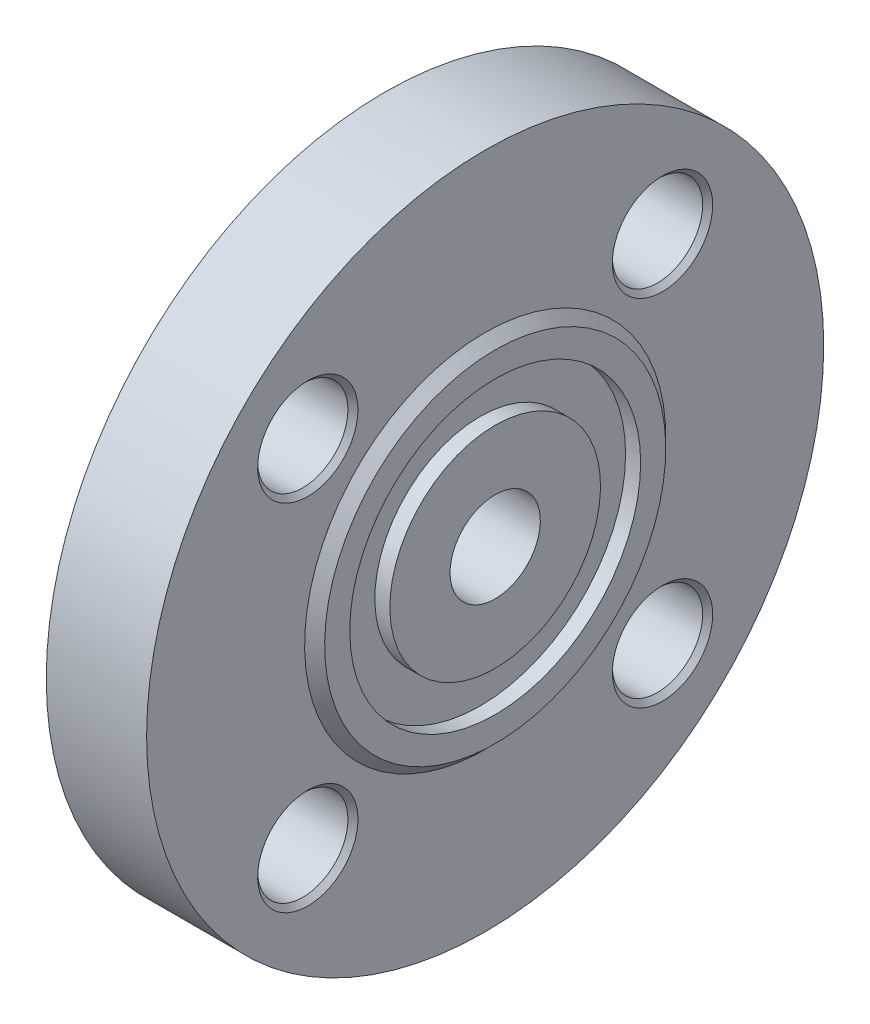
ISO-10303-21;
HEADER;
FILE_DESCRIPTION(('STEP AP214'),'2;1');
FILE_NAME('part.step','',(''),(''),'','','');
FILE_SCHEMA(('AUTOMOTIVE_DESIGN { 1 0 10303 214 1 1 1 1 }'));
ENDSEC;
DATA;
#1=APPLICATION_CONTEXT('core data for automotive mechanical design processes');
#2=APPLICATION_PROTOCOL_DEFINITION('international standard','automotive_design',2000,#1);
#3=PRODUCT_CONTEXT('',#1,'mechanical');
#4=PRODUCT('Part','Part','',(#3));
#5=PRODUCT_RELATED_PRODUCT_CATEGORY('part','',(#4));
#6=PRODUCT_DEFINITION_FORMATION('','',#4);
#7=PRODUCT_DEFINITION_CONTEXT('part definition',#1,'design');
#8=PRODUCT_DEFINITION('design','',#6,#7);
#9=PRODUCT_DEFINITION_SHAPE('','',#8);
#10=(LENGTH_UNIT() NAMED_UNIT(*) SI_UNIT(.MILLI.,.METRE.));
#11=(NAMED_UNIT(*) PLANE_ANGLE_UNIT() SI_UNIT($,.RADIAN.));
#12=(NAMED_UNIT(*) SI_UNIT($,.STERADIAN.) SOLID_ANGLE_UNIT());
#13=UNCERTAINTY_MEASURE_WITH_UNIT(LENGTH_MEASURE(1.E-05),#10,'distance_accuracy_value','');
#14=(GEOMETRIC_REPRESENTATION_CONTEXT(3) GLOBAL_UNCERTAINTY_ASSIGNED_CONTEXT((#13)) GLOBAL_UNIT_ASSIGNED_CONTEXT((#10,
#11,#12)) REPRESENTATION_CONTEXT('',''));
#15=CARTESIAN_POINT('',(0.,0.,0.));
#16=DIRECTION('',(0.,0.,1.));
#17=DIRECTION('',(1.,0.,0.));
#18=AXIS2_PLACEMENT_3D('',#15,#16,#17);
#19=CARTESIAN_POINT('',(0.,21.,0.));
#20=DIRECTION('',(1.,0.,0.));
#21=DIRECTION('',(0.,1.,0.));
#22=AXIS2_PLACEMENT_3D('',#19,#20,#21);
#23=PLANE('',#22);
#24=CARTESIAN_POINT('',(0.,0.,0.));
#25=DIRECTION('',(1.,0.,0.));
#26=DIRECTION('',(0.,1.,0.));
#27=AXIS2_PLACEMENT_3D('',#24,#25,#26);
#28=CIRCLE('',#27,21.);
#29=CARTESIAN_POINT('',(0.,21.,0.));
#30=VERTEX_POINT('',#29);
#31=EDGE_CURVE('E96',#30,#30,#28,.T.);
#32=ORIENTED_EDGE('',*,*,#31,.T.);
#33=EDGE_LOOP('',(#32));
#34=FACE_BOUND('',#33,.T.);
#35=CARTESIAN_POINT('',(0.,0.,0.));
#36=DIRECTION('',(1.,0.,0.));
#37=DIRECTION('',(0.,1.,0.));
#38=AXIS2_PLACEMENT_3D('',#35,#36,#37);
#39=CIRCLE('',#38,9.);
#40=CARTESIAN_POINT('',(0.,9.,0.));
#41=VERTEX_POINT('',#40);
#42=EDGE_CURVE('E135',#41,#41,#39,.T.);
#43=ORIENTED_EDGE('',*,*,#42,.F.);
#44=EDGE_LOOP('',(#43));
#45=FACE_BOUND('',#44,.T.);
#46=ADVANCED_FACE('F37',(#34,#45),#23,.T.);
#47=CARTESIAN_POINT('',(0.,0.,0.));
#48=DIRECTION('',(1.,0.,0.));
#49=DIRECTION('',(0.,1.,0.));
#50=AXIS2_PLACEMENT_3D('',#47,#48,#49);
#51=CYLINDRICAL_SURFACE('',#50,21.);
#52=CARTESIAN_POINT('',(-3.,0.,0.));
#53=DIRECTION('',(1.,0.,0.));
#54=DIRECTION('',(0.,1.,0.));
#55=AXIS2_PLACEMENT_3D('',#52,#53,#54);
#56=CIRCLE('',#55,21.);
#57=CARTESIAN_POINT('',(-3.,21.,0.));
#58=VERTEX_POINT('',#57);
#59=EDGE_CURVE('E99',#58,#58,#56,.T.);
#60=ORIENTED_EDGE('',*,*,#59,.T.);
#61=EDGE_LOOP('',(#60));
#62=FACE_BOUND('',#61,.T.);
#63=ORIENTED_EDGE('',*,*,#31,.F.);
#64=EDGE_LOOP('',(#63));
#65=FACE_BOUND('',#64,.T.);
#66=ADVANCED_FACE('F163',(#62,#65),#51,.T.);
#67=CARTESIAN_POINT('',(-3.,29.,0.));
#68=DIRECTION('',(1.,0.,0.));
#69=DIRECTION('',(0.,1.,0.));
#70=AXIS2_PLACEMENT_3D('',#67,#68,#69);
#71=PLANE('',#70);
#72=CARTESIAN_POINT('',(-3.,0.,0.));
#73=DIRECTION('',(1.,0.,0.));
#74=DIRECTION('',(0.,1.,0.));
#75=AXIS2_PLACEMENT_3D('',#72,#73,#74);
#76=CIRCLE('',#75,29.);
#77=CARTESIAN_POINT('',(-3.,29.,0.));
#78=VERTEX_POINT('',#77);
#79=EDGE_CURVE('E102',#78,#78,#76,.T.);
#80=ORIENTED_EDGE('',*,*,#79,.T.);
#81=EDGE_LOOP('',(#80));
#82=FACE_BOUND('',#81,.T.);
#83=ORIENTED_EDGE('',*,*,#59,.F.);
#84=EDGE_LOOP('',(#83));
#85=FACE_BOUND('',#84,.T.);
#86=ADVANCED_FACE('F169',(#82,#85),#71,.T.);
#87=CARTESIAN_POINT('',(0.,0.,0.));
#88=DIRECTION('',(1.,0.,0.));
#89=DIRECTION('',(0.,1.,0.));
#90=AXIS2_PLACEMENT_3D('',#87,#88,#89);
#91=CYLINDRICAL_SURFACE('',#90,29.);
#92=CARTESIAN_POINT('',(0.,0.,0.));
#93=DIRECTION('',(1.,0.,0.));
#94=DIRECTION('',(0.,1.,0.));
#95=AXIS2_PLACEMENT_3D('',#92,#93,#94);
#96=CIRCLE('',#95,29.);
#97=CARTESIAN_POINT('',(0.,29.,0.));
#98=VERTEX_POINT('',#97);
#99=EDGE_CURVE('E105',#98,#98,#96,.T.);
#100=ORIENTED_EDGE('',*,*,#99,.T.);
#101=EDGE_LOOP('',(#100));
#102=FACE_BOUND('',#101,.T.);
#103=ORIENTED_EDGE('',*,*,#79,.F.);
#104=EDGE_LOOP('',(#103));
#105=FACE_BOUND('',#104,.T.);
#106=ADVANCED_FACE('F424',(#102,#105),#91,.F.);
#107=CARTESIAN_POINT('',(0.,34.,0.));
#108=DIRECTION('',(1.,0.,0.));
#109=DIRECTION('',(0.,1.,0.));
#110=AXIS2_PLACEMENT_3D('',#107,#108,#109);
#111=PLANE('',#110);
#112=CARTESIAN_POINT('',(0.,0.,0.));
#113=DIRECTION('',(1.,0.,0.));
#114=DIRECTION('',(0.,1.,0.));
#115=AXIS2_PLACEMENT_3D('',#112,#113,#114);
#116=CIRCLE('',#115,34.);
#117=CARTESIAN_POINT('',(0.,34.,0.));
#118=VERTEX_POINT('',#117);
#119=EDGE_CURVE('E108',#118,#118,#116,.T.);
#120=ORIENTED_EDGE('',*,*,#119,.T.);
#121=EDGE_LOOP('',(#120));
#122=FACE_BOUND('',#121,.T.);
#123=ORIENTED_EDGE('',*,*,#99,.F.);
#124=EDGE_LOOP('',(#123));
#125=FACE_BOUND('',#124,.T.);
#126=ADVANCED_FACE('F415',(#122,#125),#111,.T.);
#127=CARTESIAN_POINT('',(0.,0.,0.));
#128=DIRECTION('',(-1.,0.,0.));
#129=DIRECTION('',(0.,-1.,0.));
#130=AXIS2_PLACEMENT_3D('',#127,#128,#129);
#131=CONICAL_SURFACE('',#130,34.,0.785398163397454);
#132=CARTESIAN_POINT('',(-2.,0.,0.));
#133=DIRECTION('',(1.,0.,0.));
#134=DIRECTION('',(0.,1.,0.));
#135=AXIS2_PLACEMENT_3D('',#132,#133,#134);
#136=CIRCLE('',#135,36.);
#137=CARTESIAN_POINT('',(-2.,36.,0.));
#138=VERTEX_POINT('',#137);
#139=EDGE_CURVE('E111',#138,#138,#136,.T.);
#140=ORIENTED_EDGE('',*,*,#139,.T.);
#141=EDGE_LOOP('',(#140));
#142=FACE_BOUND('',#141,.T.);
#143=ORIENTED_EDGE('',*,*,#119,.F.);
#144=EDGE_LOOP('',(#143));
#145=FACE_BOUND('',#144,.T.);
#146=ADVANCED_FACE('F408',(#142,#145),#131,.T.);
#147=CARTESIAN_POINT('',(-2.,67.5,0.));
#148=DIRECTION('',(1.,0.,0.));
#149=DIRECTION('',(0.,1.,0.));
#150=AXIS2_PLACEMENT_3D('',#147,#148,#149);
#151=PLANE('',#150);
#152=CARTESIAN_POINT('',(-1.99999999999999,-35.3553390593268,-35.3553390593279));
#153=DIRECTION('',(1.,0.,0.));
#154=DIRECTION('',(0.,1.,0.));
#155=AXIS2_PLACEMENT_3D('',#152,#153,#154);
#156=CIRCLE('',#155,10.);
#157=CARTESIAN_POINT('',(-1.99999999999999,-25.3553390593268,-35.3553390593279));
#158=VERTEX_POINT('',#157);
#159=EDGE_CURVE('E44',#158,#158,#156,.F.);
#160=ORIENTED_EDGE('',*,*,#159,.T.);
#161=EDGE_LOOP('',(#160));
#162=FACE_BOUND('',#161,.T.);
#163=CARTESIAN_POINT('',(-1.99999999999999,-35.3553390593276,35.3553390593272));
#164=DIRECTION('',(1.,0.,0.));
#165=DIRECTION('',(0.,1.,0.));
#166=AXIS2_PLACEMENT_3D('',#163,#164,#165);
#167=CIRCLE('',#166,10.);
#168=CARTESIAN_POINT('',(-1.99999999999999,-25.3553390593276,35.3553390593272));
#169=VERTEX_POINT('',#168);
#170=EDGE_CURVE('E60',#169,#169,#167,.F.);
#171=ORIENTED_EDGE('',*,*,#170,.T.);
#172=EDGE_LOOP('',(#171));
#173=FACE_BOUND('',#172,.T.);
#174=CARTESIAN_POINT('',(-2.,35.3553390593271,35.3553390593277));
#175=DIRECTION('',(1.,0.,0.));
#176=DIRECTION('',(0.,1.,0.));
#177=AXIS2_PLACEMENT_3D('',#174,#175,#176);
#178=CIRCLE('',#177,10.);
#179=CARTESIAN_POINT('',(-2.,45.3553390593271,35.3553390593277));
#180=VERTEX_POINT('',#179);
#181=EDGE_CURVE('E72',#180,#180,#178,.F.);
#182=ORIENTED_EDGE('',*,*,#181,.T.);
#183=EDGE_LOOP('',(#182));
#184=FACE_BOUND('',#183,.T.);
#185=CARTESIAN_POINT('',(-2.,35.3553390593276,-35.3553390593272));
#186=DIRECTION('',(1.,0.,0.));
#187=DIRECTION('',(0.,1.,0.));
#188=AXIS2_PLACEMENT_3D('',#185,#186,#187);
#189=CIRCLE('',#188,9.99999999999999);
#190=CARTESIAN_POINT('',(-2.,45.3553390593276,-35.3553390593272));
#191=VERTEX_POINT('',#190);
#192=EDGE_CURVE('E84',#191,#191,#189,.F.);
#193=ORIENTED_EDGE('',*,*,#192,.T.);
#194=EDGE_LOOP('',(#193));
#195=FACE_BOUND('',#194,.T.);
#196=CARTESIAN_POINT('',(-2.,0.,0.));
#197=DIRECTION('',(1.,0.,0.));
#198=DIRECTION('',(0.,1.,0.));
#199=AXIS2_PLACEMENT_3D('',#196,#197,#198);
#200=CIRCLE('',#199,67.5);
#201=CARTESIAN_POINT('',(-2.00000000000001,67.5,0.));
#202=VERTEX_POINT('',#201);
#203=EDGE_CURVE('E114',#202,#202,#200,.T.);
#204=ORIENTED_EDGE('',*,*,#203,.T.);
#205=EDGE_LOOP('',(#204));
#206=FACE_BOUND('',#205,.T.);
#207=ORIENTED_EDGE('',*,*,#139,.F.);
#208=EDGE_LOOP('',(#207));
#209=FACE_BOUND('',#208,.T.);
#210=ADVANCED_FACE('F399',(#162,#173,#184,#195,#206,#209),#151,.T.);
#211=CARTESIAN_POINT('',(0.,0.,0.));
#212=DIRECTION('',(1.,0.,0.));
#213=DIRECTION('',(0.,1.,0.));
#214=AXIS2_PLACEMENT_3D('',#211,#212,#213);
#215=CYLINDRICAL_SURFACE('',#214,67.5);
#216=CARTESIAN_POINT('',(-22.,0.,0.));
#217=DIRECTION('',(1.,0.,0.));
#218=DIRECTION('',(0.,1.,0.));
#219=AXIS2_PLACEMENT_3D('',#216,#217,#218);
#220=CIRCLE('',#219,67.5);
#221=CARTESIAN_POINT('',(-22.,67.5,0.));
#222=VERTEX_POINT('',#221);
#223=EDGE_CURVE('E117',#222,#222,#220,.T.);
#224=ORIENTED_EDGE('',*,*,#223,.T.);
#225=EDGE_LOOP('',(#224));
#226=FACE_BOUND('',#225,.T.);
#227=ORIENTED_EDGE('',*,*,#203,.F.);
#228=EDGE_LOOP('',(#227));
#229=FACE_BOUND('',#228,.T.);
#230=ADVANCED_FACE('F391',(#226,#229),#215,.T.);
#231=CARTESIAN_POINT('',(-22.,29.3725425842122,0.));
#232=DIRECTION('',(-1.,0.,0.));
#233=DIRECTION('',(0.,-1.,0.));
#234=AXIS2_PLACEMENT_3D('',#231,#232,#233);
#235=PLANE('',#234);
#236=CARTESIAN_POINT('',(-22.,-35.3553390593268,-35.3553390593279));
#237=DIRECTION('',(-1.,0.,0.));
#238=DIRECTION('',(0.,-1.,0.));
#239=AXIS2_PLACEMENT_3D('',#236,#237,#238);
#240=CIRCLE('',#239,10.);
#241=CARTESIAN_POINT('',(-22.,-45.3553390593268,-35.3553390593279));
#242=VERTEX_POINT('',#241);
#243=EDGE_CURVE('E10',#242,#242,#240,.F.);
#244=ORIENTED_EDGE('',*,*,#243,.T.);
#245=EDGE_LOOP('',(#244));
#246=FACE_BOUND('',#245,.T.);
#247=CARTESIAN_POINT('',(-22.,-35.3553390593276,35.3553390593272));
#248=DIRECTION('',(-1.,0.,0.));
#249=DIRECTION('',(0.,-1.,0.));
#250=AXIS2_PLACEMENT_3D('',#247,#248,#249);
#251=CIRCLE('',#250,9.99999999999999);
#252=CARTESIAN_POINT('',(-22.,-45.3553390593276,35.3553390593272));
#253=VERTEX_POINT('',#252);
#254=EDGE_CURVE('E57',#253,#253,#251,.F.);
#255=ORIENTED_EDGE('',*,*,#254,.T.);
#256=EDGE_LOOP('',(#255));
#257=FACE_BOUND('',#256,.T.);
#258=CARTESIAN_POINT('',(-22.,35.3553390593271,35.3553390593277));
#259=DIRECTION('',(-1.,0.,0.));
#260=DIRECTION('',(0.,-1.,0.));
#261=AXIS2_PLACEMENT_3D('',#258,#259,#260);
#262=CIRCLE('',#261,10.);
#263=CARTESIAN_POINT('',(-22.,25.355339059327,35.3553390593277));
#264=VERTEX_POINT('',#263);
#265=EDGE_CURVE('E69',#264,#264,#262,.F.);
#266=ORIENTED_EDGE('',*,*,#265,.T.);
#267=EDGE_LOOP('',(#266));
#268=FACE_BOUND('',#267,.T.);
#269=CARTESIAN_POINT('',(-22.,35.3553390593276,-35.3553390593272));
#270=DIRECTION('',(-1.,0.,0.));
#271=DIRECTION('',(0.,-1.,0.));
#272=AXIS2_PLACEMENT_3D('',#269,#270,#271);
#273=CIRCLE('',#272,9.99999999999998);
#274=CARTESIAN_POINT('',(-22.,25.3553390593276,-35.3553390593272));
#275=VERTEX_POINT('',#274);
#276=EDGE_CURVE('E81',#275,#275,#273,.F.);
#277=ORIENTED_EDGE('',*,*,#276,.T.);
#278=EDGE_LOOP('',(#277));
#279=FACE_BOUND('',#278,.T.);
#280=CARTESIAN_POINT('',(-22.,0.,0.));
#281=DIRECTION('',(1.,0.,0.));
#282=DIRECTION('',(0.,1.,0.));
#283=AXIS2_PLACEMENT_3D('',#280,#281,#282);
#284=CIRCLE('',#283,29.3725425842122);
#285=CARTESIAN_POINT('',(-22.,29.3725425842122,0.));
#286=VERTEX_POINT('',#285);
#287=EDGE_CURVE('E120',#286,#286,#284,.T.);
#288=ORIENTED_EDGE('',*,*,#287,.T.);
#289=EDGE_LOOP('',(#288));
#290=FACE_BOUND('',#289,.T.);
#291=ORIENTED_EDGE('',*,*,#223,.F.);
#292=EDGE_LOOP('',(#291));
#293=FACE_BOUND('',#292,.T.);
#294=ADVANCED_FACE('F382',(#246,#257,#268,#279,#290,#293),#235,.T.);
#295=CARTESIAN_POINT('',(-27.,0.,0.));
#296=DIRECTION('',(1.,0.,0.));
#297=DIRECTION('',(0.,1.,0.));
#298=AXIS2_PLACEMENT_3D('',#295,#296,#297);
#299=TOROIDAL_SURFACE('',#298,29.3725425842122,5.);
#300=CARTESIAN_POINT('',(-25.1269670329205,0.,0.));
#301=DIRECTION('',(1.,0.,0.));
#302=DIRECTION('',(0.,1.,0.));
#303=AXIS2_PLACEMENT_3D('',#300,#301,#302);
#304=CIRCLE('',#303,24.7366233113782);
#305=CARTESIAN_POINT('',(-25.1269670329205,24.7366233113782,0.));
#306=VERTEX_POINT('',#305);
#307=EDGE_CURVE('E123',#306,#306,#304,.T.);
#308=ORIENTED_EDGE('',*,*,#307,.T.);
#309=EDGE_LOOP('',(#308));
#310=FACE_BOUND('',#309,.T.);
#311=ORIENTED_EDGE('',*,*,#287,.F.);
#312=EDGE_LOOP('',(#311));
#313=FACE_BOUND('',#312,.T.);
#314=ADVANCED_FACE('F374',(#310,#313),#299,.F.);
#315=CARTESIAN_POINT('',(-25.1269670329205,0.,0.));
#316=DIRECTION('',(1.,0.,0.));
#317=DIRECTION('',(0.,1.,0.));
#318=AXIS2_PLACEMENT_3D('',#315,#316,#317);
#319=CONICAL_SURFACE('',#318,24.7366233113782,0.383972435438746);
#320=CARTESIAN_POINT('',(-45.8497371127724,0.,0.));
#321=DIRECTION('',(1.,0.,0.));
#322=DIRECTION('',(0.,0.,-1.));
#323=AXIS2_PLACEMENT_3D('',#320,#321,#322);
#324=CIRCLE('',#323,16.3640807271661);
#325=CARTESIAN_POINT('',(-45.8497371127724,0.,-16.3640807271661));
#326=VERTEX_POINT('',#325);
#327=EDGE_CURVE('E93',#326,#326,#324,.F.);
#328=ORIENTED_EDGE('',*,*,#327,.F.);
#329=EDGE_LOOP('',(#328));
#330=FACE_BOUND('',#329,.T.);
#331=ORIENTED_EDGE('',*,*,#307,.F.);
#332=EDGE_LOOP('',(#331));
#333=FACE_BOUND('',#332,.T.);
#334=ADVANCED_FACE('F365',(#330,#333),#319,.T.);
#335=CARTESIAN_POINT('',(0.,0.,0.));
#336=DIRECTION('',(1.,0.,0.));
#337=DIRECTION('',(0.,1.,0.));
#338=AXIS2_PLACEMENT_3D('',#335,#336,#337);
#339=CYLINDRICAL_SURFACE('',#338,11.);
#340=CARTESIAN_POINT('',(-59.5,0.,0.));
#341=DIRECTION('',(1.,0.,0.));
#342=DIRECTION('',(0.,1.,0.));
#343=AXIS2_PLACEMENT_3D('',#340,#341,#342);
#344=CIRCLE('',#343,11.);
#345=CARTESIAN_POINT('',(-59.5,11.,0.));
#346=VERTEX_POINT('',#345);
#347=EDGE_CURVE('E129',#346,#346,#344,.T.);
#348=ORIENTED_EDGE('',*,*,#347,.T.);
#349=EDGE_LOOP('',(#348));
#350=FACE_BOUND('',#349,.T.);
#351=CARTESIAN_POINT('',(-50.5,0.,0.));
#352=DIRECTION('',(1.,0.,0.));
#353=DIRECTION('',(0.,1.,0.));
#354=AXIS2_PLACEMENT_3D('',#351,#352,#353);
#355=CIRCLE('',#354,11.);
#356=CARTESIAN_POINT('',(-50.5,11.,0.));
#357=VERTEX_POINT('',#356);
#358=EDGE_CURVE('E126',#357,#357,#355,.T.);
#359=ORIENTED_EDGE('',*,*,#358,.F.);
#360=EDGE_LOOP('',(#359));
#361=FACE_BOUND('',#360,.T.);
#362=ADVANCED_FACE('F356',(#350,#361),#339,.T.);
#363=CARTESIAN_POINT('',(-59.5,8.99999999999999,0.));
#364=DIRECTION('',(-1.,0.,0.));
#365=DIRECTION('',(0.,-1.,0.));
#366=AXIS2_PLACEMENT_3D('',#363,#364,#365);
#367=PLANE('',#366);
#368=CARTESIAN_POINT('',(-59.5,0.,0.));
#369=DIRECTION('',(1.,0.,0.));
#370=DIRECTION('',(0.,1.,0.));
#371=AXIS2_PLACEMENT_3D('',#368,#369,#370);
#372=CIRCLE('',#371,9.);
#373=CARTESIAN_POINT('',(-59.5,8.99999999999999,0.));
#374=VERTEX_POINT('',#373);
#375=EDGE_CURVE('E132',#374,#374,#372,.T.);
#376=ORIENTED_EDGE('',*,*,#375,.T.);
#377=EDGE_LOOP('',(#376));
#378=FACE_BOUND('',#377,.T.);
#379=ORIENTED_EDGE('',*,*,#347,.F.);
#380=EDGE_LOOP('',(#379));
#381=FACE_BOUND('',#380,.T.);
#382=ADVANCED_FACE('F347',(#378,#381),#367,.T.);
#383=CARTESIAN_POINT('',(0.,0.,0.));
#384=DIRECTION('',(1.,0.,0.));
#385=DIRECTION('',(0.,1.,0.));
#386=AXIS2_PLACEMENT_3D('',#383,#384,#385);
#387=CYLINDRICAL_SURFACE('',#386,9.);
#388=ORIENTED_EDGE('',*,*,#42,.T.);
#389=EDGE_LOOP('',(#388));
#390=FACE_BOUND('',#389,.T.);
#391=ORIENTED_EDGE('',*,*,#375,.F.);
#392=EDGE_LOOP('',(#391));
#393=FACE_BOUND('',#392,.T.);
#394=ADVANCED_FACE('F337',(#390,#393),#387,.F.);
#395=CARTESIAN_POINT('',(-47.722770079852,0.,0.));
#396=DIRECTION('',(1.,0.,0.));
#397=DIRECTION('',(0.,0.,-1.));
#398=AXIS2_PLACEMENT_3D('',#395,#396,#397);
#399=TOROIDAL_SURFACE('',#398,21.,5.);
#400=CARTESIAN_POINT('',(-47.722770079852,0.,0.));
#401=DIRECTION('',(1.,0.,0.));
#402=DIRECTION('',(0.,0.,-1.));
#403=AXIS2_PLACEMENT_3D('',#400,#401,#402);
#404=CIRCLE('',#403,16.);
#405=CARTESIAN_POINT('',(-47.722770079852,0.,-16.));
#406=VERTEX_POINT('',#405);
#407=EDGE_CURVE('E138',#406,#406,#404,.T.);
#408=ORIENTED_EDGE('',*,*,#407,.T.);
#409=EDGE_LOOP('',(#408));
#410=FACE_BOUND('',#409,.T.);
#411=ORIENTED_EDGE('',*,*,#327,.T.);
#412=EDGE_LOOP('',(#411));
#413=FACE_BOUND('',#412,.T.);
#414=ADVANCED_FACE('F160',(#410,#413),#399,.F.);
#415=CARTESIAN_POINT('',(0.,0.,0.));
#416=DIRECTION('',(1.,0.,0.));
#417=DIRECTION('',(0.,0.,-1.));
#418=AXIS2_PLACEMENT_3D('',#415,#416,#417);
#419=CYLINDRICAL_SURFACE('',#418,16.);
#420=CARTESIAN_POINT('',(-50.5,0.,0.));
#421=DIRECTION('',(1.,0.,0.));
#422=DIRECTION('',(0.,0.,-1.));
#423=AXIS2_PLACEMENT_3D('',#420,#421,#422);
#424=CIRCLE('',#423,16.);
#425=CARTESIAN_POINT('',(-50.5,0.,-16.));
#426=VERTEX_POINT('',#425);
#427=EDGE_CURVE('E141',#426,#426,#424,.T.);
#428=ORIENTED_EDGE('',*,*,#427,.T.);
#429=EDGE_LOOP('',(#428));
#430=FACE_BOUND('',#429,.T.);
#431=ORIENTED_EDGE('',*,*,#407,.F.);
#432=EDGE_LOOP('',(#431));
#433=FACE_BOUND('',#432,.T.);
#434=ADVANCED_FACE('F145',(#430,#433),#419,.T.);
#435=CARTESIAN_POINT('',(-50.5,11.,0.));
#436=DIRECTION('',(-1.,0.,0.));
#437=DIRECTION('',(0.,0.,1.));
#438=AXIS2_PLACEMENT_3D('',#435,#436,#437);
#439=PLANE('',#438);
#440=ORIENTED_EDGE('',*,*,#358,.T.);
#441=EDGE_LOOP('',(#440));
#442=FACE_BOUND('',#441,.T.);
#443=ORIENTED_EDGE('',*,*,#427,.F.);
#444=EDGE_LOOP('',(#443));
#445=FACE_BOUND('',#444,.T.);
#446=ADVANCED_FACE('F148',(#442,#445),#439,.T.);
#447=CARTESIAN_POINT('',(-59.5,35.3553390593276,-35.3553390593272));
#448=DIRECTION('',(1.,0.,0.));
#449=DIRECTION('',(0.,1.,0.));
#450=AXIS2_PLACEMENT_3D('',#447,#448,#449);
#451=CYLINDRICAL_SURFACE('',#450,9.);
#452=CARTESIAN_POINT('',(-2.99999999999998,35.3553390593276,-35.3553390593272));
#453=DIRECTION('',(1.,0.,0.));
#454=DIRECTION('',(0.,0.,-1.));
#455=AXIS2_PLACEMENT_3D('',#452,#453,#454);
#456=CIRCLE('',#455,9.);
#457=CARTESIAN_POINT('',(-2.99999999999998,35.3553390593276,-44.3553390593272));
#458=VERTEX_POINT('',#457);
#459=EDGE_CURVE('E87',#458,#458,#456,.T.);
#460=ORIENTED_EDGE('',*,*,#459,.T.);
#461=EDGE_LOOP('',(#460));
#462=FACE_BOUND('',#461,.T.);
#463=CARTESIAN_POINT('',(-21.0000000000001,35.3553390593276,-35.3553390593272));
#464=DIRECTION('',(-1.,0.,0.));
#465=DIRECTION('',(0.,0.,1.));
#466=AXIS2_PLACEMENT_3D('',#463,#464,#465);
#467=CIRCLE('',#466,9.);
#468=CARTESIAN_POINT('',(-21.0000000000001,35.3553390593276,-26.3553390593272));
#469=VERTEX_POINT('',#468);
#470=EDGE_CURVE('E90',#469,#469,#467,.T.);
#471=ORIENTED_EDGE('',*,*,#470,.T.);
#472=EDGE_LOOP('',(#471));
#473=FACE_BOUND('',#472,.T.);
#474=ADVANCED_FACE('F150',(#462,#473),#451,.F.);
#475=CARTESIAN_POINT('',(-2.99999999999998,35.3553390593276,-35.3553390593272));
#476=DIRECTION('',(1.,0.,0.));
#477=DIRECTION('',(0.,0.,-1.));
#478=AXIS2_PLACEMENT_3D('',#475,#476,#477);
#479=CONICAL_SURFACE('',#478,9.,0.785398163397458);
#480=ORIENTED_EDGE('',*,*,#192,.F.);
#481=EDGE_LOOP('',(#480));
#482=FACE_BOUND('',#481,.T.);
#483=ORIENTED_EDGE('',*,*,#459,.F.);
#484=EDGE_LOOP('',(#483));
#485=FACE_BOUND('',#484,.T.);
#486=ADVANCED_FACE('F157',(#482,#485),#479,.F.);
#487=CARTESIAN_POINT('',(-21.0000000000001,35.3553390593276,-35.3553390593272));
#488=DIRECTION('',(-1.,0.,0.));
#489=DIRECTION('',(0.,0.,1.));
#490=AXIS2_PLACEMENT_3D('',#487,#488,#489);
#491=CONICAL_SURFACE('',#490,9.,0.785398163397466);
#492=ORIENTED_EDGE('',*,*,#276,.F.);
#493=EDGE_LOOP('',(#492));
#494=FACE_BOUND('',#493,.T.);
#495=ORIENTED_EDGE('',*,*,#470,.F.);
#496=EDGE_LOOP('',(#495));
#497=FACE_BOUND('',#496,.T.);
#498=ADVANCED_FACE('F181',(#494,#497),#491,.F.);
#499=CARTESIAN_POINT('',(-59.5,35.3553390593271,35.3553390593277));
#500=DIRECTION('',(1.,0.,0.));
#501=DIRECTION('',(0.,1.,0.));
#502=AXIS2_PLACEMENT_3D('',#499,#500,#501);
#503=CYLINDRICAL_SURFACE('',#502,9.);
#504=CARTESIAN_POINT('',(-3.00000000000001,35.3553390593271,35.3553390593277));
#505=DIRECTION('',(1.,0.,0.));
#506=DIRECTION('',(0.,0.,-1.));
#507=AXIS2_PLACEMENT_3D('',#504,#505,#506);
#508=CIRCLE('',#507,9.);
#509=CARTESIAN_POINT('',(-3.00000000000001,35.3553390593271,26.3553390593277));
#510=VERTEX_POINT('',#509);
#511=EDGE_CURVE('E75',#510,#510,#508,.T.);
#512=ORIENTED_EDGE('',*,*,#511,.T.);
#513=EDGE_LOOP('',(#512));
#514=FACE_BOUND('',#513,.T.);
#515=CARTESIAN_POINT('',(-21.,35.3553390593271,35.3553390593277));
#516=DIRECTION('',(-1.,0.,0.));
#517=DIRECTION('',(0.,0.,1.));
#518=AXIS2_PLACEMENT_3D('',#515,#516,#517);
#519=CIRCLE('',#518,9.);
#520=CARTESIAN_POINT('',(-21.,35.3553390593271,44.3553390593277));
#521=VERTEX_POINT('',#520);
#522=EDGE_CURVE('E78',#521,#521,#519,.T.);
#523=ORIENTED_EDGE('',*,*,#522,.T.);
#524=EDGE_LOOP('',(#523));
#525=FACE_BOUND('',#524,.T.);
#526=ADVANCED_FACE('F187',(#514,#525),#503,.F.);
#527=CARTESIAN_POINT('',(-59.5,-35.3553390593276,35.3553390593272));
#528=DIRECTION('',(1.,0.,0.));
#529=DIRECTION('',(0.,1.,0.));
#530=AXIS2_PLACEMENT_3D('',#527,#528,#529);
#531=CYLINDRICAL_SURFACE('',#530,9.);
#532=CARTESIAN_POINT('',(-3.,-35.3553390593276,35.3553390593272));
#533=DIRECTION('',(1.,0.,0.));
#534=DIRECTION('',(0.,0.,-1.));
#535=AXIS2_PLACEMENT_3D('',#532,#533,#534);
#536=CIRCLE('',#535,9.);
#537=CARTESIAN_POINT('',(-3.,-35.3553390593276,26.3553390593272));
#538=VERTEX_POINT('',#537);
#539=EDGE_CURVE('E63',#538,#538,#536,.T.);
#540=ORIENTED_EDGE('',*,*,#539,.T.);
#541=EDGE_LOOP('',(#540));
#542=FACE_BOUND('',#541,.T.);
#543=CARTESIAN_POINT('',(-21.,-35.3553390593276,35.3553390593272));
#544=DIRECTION('',(-1.,0.,0.));
#545=DIRECTION('',(0.,0.,1.));
#546=AXIS2_PLACEMENT_3D('',#543,#544,#545);
#547=CIRCLE('',#546,9.);
#548=CARTESIAN_POINT('',(-21.,-35.3553390593276,44.3553390593272));
#549=VERTEX_POINT('',#548);
#550=EDGE_CURVE('E66',#549,#549,#547,.T.);
#551=ORIENTED_EDGE('',*,*,#550,.T.);
#552=EDGE_LOOP('',(#551));
#553=FACE_BOUND('',#552,.T.);
#554=ADVANCED_FACE('F217',(#542,#553),#531,.F.);
#555=CARTESIAN_POINT('',(-59.5,-35.3553390593268,-35.3553390593279));
#556=DIRECTION('',(1.,0.,0.));
#557=DIRECTION('',(0.,1.,0.));
#558=AXIS2_PLACEMENT_3D('',#555,#556,#557);
#559=CYLINDRICAL_SURFACE('',#558,9.);
#560=CARTESIAN_POINT('',(-3.,-35.3553390593268,-35.3553390593279));
#561=DIRECTION('',(1.,0.,0.));
#562=DIRECTION('',(0.,0.,-1.));
#563=AXIS2_PLACEMENT_3D('',#560,#561,#562);
#564=CIRCLE('',#563,9.);
#565=CARTESIAN_POINT('',(-3.,-35.3553390593268,-44.3553390593279));
#566=VERTEX_POINT('',#565);
#567=EDGE_CURVE('E48',#566,#566,#564,.T.);
#568=ORIENTED_EDGE('',*,*,#567,.T.);
#569=EDGE_LOOP('',(#568));
#570=FACE_BOUND('',#569,.T.);
#571=CARTESIAN_POINT('',(-21.,-35.3553390593268,-35.3553390593279));
#572=DIRECTION('',(-1.,0.,0.));
#573=DIRECTION('',(0.,0.,1.));
#574=AXIS2_PLACEMENT_3D('',#571,#572,#573);
#575=CIRCLE('',#574,9.);
#576=CARTESIAN_POINT('',(-21.,-35.3553390593268,-26.3553390593279));
#577=VERTEX_POINT('',#576);
#578=EDGE_CURVE('E52',#577,#577,#575,.T.);
#579=ORIENTED_EDGE('',*,*,#578,.T.);
#580=EDGE_LOOP('',(#579));
#581=FACE_BOUND('',#580,.T.);
#582=ADVANCED_FACE('F193',(#570,#581),#559,.F.);
#583=CARTESIAN_POINT('',(-3.00000000000001,35.3553390593271,35.3553390593277));
#584=DIRECTION('',(1.,0.,0.));
#585=DIRECTION('',(0.,0.,-1.));
#586=AXIS2_PLACEMENT_3D('',#583,#584,#585);
#587=CONICAL_SURFACE('',#586,9.,0.785398163397449);
#588=ORIENTED_EDGE('',*,*,#181,.F.);
#589=EDGE_LOOP('',(#588));
#590=FACE_BOUND('',#589,.T.);
#591=ORIENTED_EDGE('',*,*,#511,.F.);
#592=EDGE_LOOP('',(#591));
#593=FACE_BOUND('',#592,.T.);
#594=ADVANCED_FACE('F189',(#590,#593),#587,.F.);
#595=CARTESIAN_POINT('',(-21.,35.3553390593271,35.3553390593277));
#596=DIRECTION('',(-1.,0.,0.));
#597=DIRECTION('',(0.,0.,1.));
#598=AXIS2_PLACEMENT_3D('',#595,#596,#597);
#599=CONICAL_SURFACE('',#598,9.,0.785398163397466);
#600=ORIENTED_EDGE('',*,*,#265,.F.);
#601=EDGE_LOOP('',(#600));
#602=FACE_BOUND('',#601,.T.);
#603=ORIENTED_EDGE('',*,*,#522,.F.);
#604=EDGE_LOOP('',(#603));
#605=FACE_BOUND('',#604,.T.);
#606=ADVANCED_FACE('F192',(#602,#605),#599,.F.);
#607=CARTESIAN_POINT('',(-3.,-35.3553390593276,35.3553390593272));
#608=DIRECTION('',(1.,0.,0.));
#609=DIRECTION('',(0.,0.,-1.));
#610=AXIS2_PLACEMENT_3D('',#607,#608,#609);
#611=CONICAL_SURFACE('',#610,9.,0.785398163397447);
#612=ORIENTED_EDGE('',*,*,#170,.F.);
#613=EDGE_LOOP('',(#612));
#614=FACE_BOUND('',#613,.T.);
#615=ORIENTED_EDGE('',*,*,#539,.F.);
#616=EDGE_LOOP('',(#615));
#617=FACE_BOUND('',#616,.T.);
#618=ADVANCED_FACE('F197',(#614,#617),#611,.F.);
#619=CARTESIAN_POINT('',(-21.,-35.3553390593276,35.3553390593272));
#620=DIRECTION('',(-1.,0.,0.));
#621=DIRECTION('',(0.,0.,1.));
#622=AXIS2_PLACEMENT_3D('',#619,#620,#621);
#623=CONICAL_SURFACE('',#622,9.,0.785398163397455);
#624=ORIENTED_EDGE('',*,*,#254,.F.);
#625=EDGE_LOOP('',(#624));
#626=FACE_BOUND('',#625,.T.);
#627=ORIENTED_EDGE('',*,*,#550,.F.);
#628=EDGE_LOOP('',(#627));
#629=FACE_BOUND('',#628,.T.);
#630=ADVANCED_FACE('F201',(#626,#629),#623,.F.);
#631=CARTESIAN_POINT('',(-3.,-35.3553390593268,-35.3553390593279));
#632=DIRECTION('',(1.,0.,0.));
#633=DIRECTION('',(0.,0.,-1.));
#634=AXIS2_PLACEMENT_3D('',#631,#632,#633);
#635=CONICAL_SURFACE('',#634,9.,0.785398163397446);
#636=ORIENTED_EDGE('',*,*,#159,.F.);
#637=EDGE_LOOP('',(#636));
#638=FACE_BOUND('',#637,.T.);
#639=ORIENTED_EDGE('',*,*,#567,.F.);
#640=EDGE_LOOP('',(#639));
#641=FACE_BOUND('',#640,.T.);
#642=ADVANCED_FACE('F204',(#638,#641),#635,.F.);
#643=CARTESIAN_POINT('',(-21.,-35.3553390593268,-35.3553390593279));
#644=DIRECTION('',(-1.,0.,0.));
#645=DIRECTION('',(0.,0.,1.));
#646=AXIS2_PLACEMENT_3D('',#643,#644,#645);
#647=CONICAL_SURFACE('',#646,9.,0.785398163397455);
#648=ORIENTED_EDGE('',*,*,#243,.F.);
#649=EDGE_LOOP('',(#648));
#650=FACE_BOUND('',#649,.T.);
#651=ORIENTED_EDGE('',*,*,#578,.F.);
#652=EDGE_LOOP('',(#651));
#653=FACE_BOUND('',#652,.T.);
#654=ADVANCED_FACE('F39',(#650,#653),#647,.F.);
#655=CLOSED_SHELL('',(#46,#66,#86,#106,#126,#146,#210,#230,#294,#314,#334,#362,#382,#394,#414,
#434,#446,#474,#486,#498,#526,#554,#582,#594,#606,#618,#630,#642,#654));
#656=MANIFOLD_SOLID_BREP('B2',#655);
#657=ADVANCED_BREP_SHAPE_REPRESENTATION('',(#18,#656),#14);
#658=SHAPE_DEFINITION_REPRESENTATION(#9,#657);
ENDSEC;
END-ISO-10303-21;
